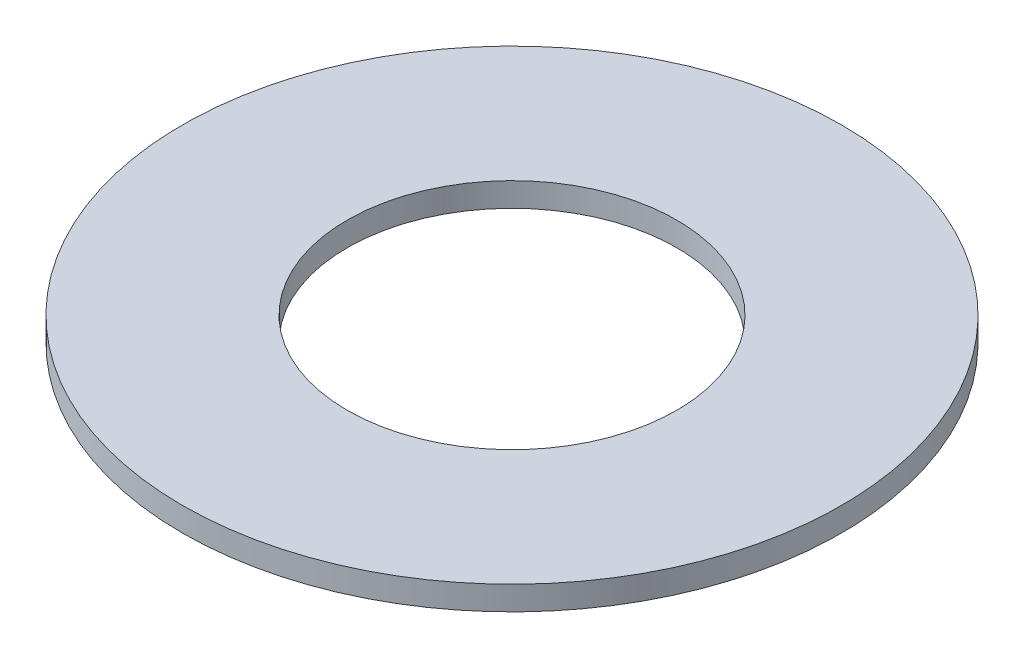
ISO-10303-21;
HEADER;
FILE_DESCRIPTION(('STEP AP214'),'2;1');
FILE_NAME('part.step','',(''),(''),'','','');
FILE_SCHEMA(('AUTOMOTIVE_DESIGN { 1 0 10303 214 1 1 1 1 }'));
ENDSEC;
DATA;
#1=APPLICATION_CONTEXT('core data for automotive mechanical design processes');
#2=APPLICATION_PROTOCOL_DEFINITION('international standard','automotive_design',2000,#1);
#3=PRODUCT_CONTEXT('',#1,'mechanical');
#4=PRODUCT('Part','Part','',(#3));
#5=PRODUCT_RELATED_PRODUCT_CATEGORY('part','',(#4));
#6=PRODUCT_DEFINITION_FORMATION('','',#4);
#7=PRODUCT_DEFINITION_CONTEXT('part definition',#1,'design');
#8=PRODUCT_DEFINITION('design','',#6,#7);
#9=PRODUCT_DEFINITION_SHAPE('','',#8);
#10=(LENGTH_UNIT() NAMED_UNIT(*) SI_UNIT(.MILLI.,.METRE.));
#11=(NAMED_UNIT(*) PLANE_ANGLE_UNIT() SI_UNIT($,.RADIAN.));
#12=(NAMED_UNIT(*) SI_UNIT($,.STERADIAN.) SOLID_ANGLE_UNIT());
#13=UNCERTAINTY_MEASURE_WITH_UNIT(LENGTH_MEASURE(1.E-05),#10,'distance_accuracy_value','');
#14=(GEOMETRIC_REPRESENTATION_CONTEXT(3) GLOBAL_UNCERTAINTY_ASSIGNED_CONTEXT((#13)) GLOBAL_UNIT_ASSIGNED_CONTEXT((#10,
#11,#12)) REPRESENTATION_CONTEXT('',''));
#15=CARTESIAN_POINT('',(0.,0.,0.));
#16=DIRECTION('',(0.,0.,1.));
#17=DIRECTION('',(1.,0.,0.));
#18=AXIS2_PLACEMENT_3D('',#15,#16,#17);
#19=CARTESIAN_POINT('',(0.,0.8,0.));
#20=DIRECTION('',(0.,1.,0.));
#21=DIRECTION('',(0.,0.,1.));
#22=AXIS2_PLACEMENT_3D('',#19,#20,#21);
#23=PLANE('',#22);
#24=CARTESIAN_POINT('',(0.,0.8,0.));
#25=DIRECTION('',(0.,1.,0.));
#26=DIRECTION('',(0.,0.,1.));
#27=AXIS2_PLACEMENT_3D('',#24,#25,#26);
#28=CIRCLE('',#27,11.);
#29=CARTESIAN_POINT('',(0.,0.8,11.));
#30=VERTEX_POINT('',#29);
#31=EDGE_CURVE('E10',#30,#30,#28,.T.);
#32=ORIENTED_EDGE('',*,*,#31,.T.);
#33=EDGE_LOOP('',(#32));
#34=FACE_BOUND('',#33,.T.);
#35=CARTESIAN_POINT('',(0.,0.8,0.));
#36=DIRECTION('',(0.,1.,0.));
#37=DIRECTION('',(0.,0.,1.));
#38=AXIS2_PLACEMENT_3D('',#35,#36,#37);
#39=CIRCLE('',#38,5.5);
#40=CARTESIAN_POINT('',(0.,0.8,5.5));
#41=VERTEX_POINT('',#40);
#42=EDGE_CURVE('E42',#41,#41,#39,.T.);
#43=ORIENTED_EDGE('',*,*,#42,.F.);
#44=EDGE_LOOP('',(#43));
#45=FACE_BOUND('',#44,.T.);
#46=ADVANCED_FACE('F31',(#34,#45),#23,.T.);
#47=CARTESIAN_POINT('',(0.,0.,0.));
#48=DIRECTION('',(0.,1.,0.));
#49=DIRECTION('',(0.,0.,1.));
#50=AXIS2_PLACEMENT_3D('',#47,#48,#49);
#51=PLANE('',#50);
#52=CARTESIAN_POINT('',(0.,0.,0.));
#53=DIRECTION('',(0.,1.,0.));
#54=DIRECTION('',(0.,0.,1.));
#55=AXIS2_PLACEMENT_3D('',#52,#53,#54);
#56=CIRCLE('',#55,11.);
#57=CARTESIAN_POINT('',(0.,0.,11.));
#58=VERTEX_POINT('',#57);
#59=EDGE_CURVE('E35',#58,#58,#56,.T.);
#60=ORIENTED_EDGE('',*,*,#59,.F.);
#61=EDGE_LOOP('',(#60));
#62=FACE_BOUND('',#61,.T.);
#63=CARTESIAN_POINT('',(0.,0.,0.));
#64=DIRECTION('',(0.,1.,0.));
#65=DIRECTION('',(0.,0.,1.));
#66=AXIS2_PLACEMENT_3D('',#63,#64,#65);
#67=CIRCLE('',#66,5.5);
#68=CARTESIAN_POINT('',(0.,0.,5.5));
#69=VERTEX_POINT('',#68);
#70=EDGE_CURVE('E44',#69,#69,#67,.T.);
#71=ORIENTED_EDGE('',*,*,#70,.T.);
#72=EDGE_LOOP('',(#71));
#73=FACE_BOUND('',#72,.T.);
#74=ADVANCED_FACE('F54',(#62,#73),#51,.F.);
#75=CARTESIAN_POINT('',(0.,0.8,0.));
#76=DIRECTION('',(0.,-1.,0.));
#77=DIRECTION('',(0.,0.,-1.));
#78=AXIS2_PLACEMENT_3D('',#75,#76,#77);
#79=CYLINDRICAL_SURFACE('',#78,11.);
#80=ORIENTED_EDGE('',*,*,#31,.F.);
#81=EDGE_LOOP('',(#80));
#82=FACE_BOUND('',#81,.T.);
#83=ORIENTED_EDGE('',*,*,#59,.T.);
#84=EDGE_LOOP('',(#83));
#85=FACE_BOUND('',#84,.T.);
#86=ADVANCED_FACE('F33',(#82,#85),#79,.T.);
#87=CARTESIAN_POINT('',(0.,0.8,0.));
#88=DIRECTION('',(0.,-1.,0.));
#89=DIRECTION('',(0.,0.,-1.));
#90=AXIS2_PLACEMENT_3D('',#87,#88,#89);
#91=CYLINDRICAL_SURFACE('',#90,5.5);
#92=ORIENTED_EDGE('',*,*,#42,.T.);
#93=EDGE_LOOP('',(#92));
#94=FACE_BOUND('',#93,.T.);
#95=ORIENTED_EDGE('',*,*,#70,.F.);
#96=EDGE_LOOP('',(#95));
#97=FACE_BOUND('',#96,.T.);
#98=ADVANCED_FACE('F50',(#94,#97),#91,.F.);
#99=CLOSED_SHELL('',(#46,#74,#86,#98));
#100=MANIFOLD_SOLID_BREP('B2',#99);
#101=ADVANCED_BREP_SHAPE_REPRESENTATION('',(#18,#100),#14);
#102=SHAPE_DEFINITION_REPRESENTATION(#9,#101);
ENDSEC;
END-ISO-10303-21;
